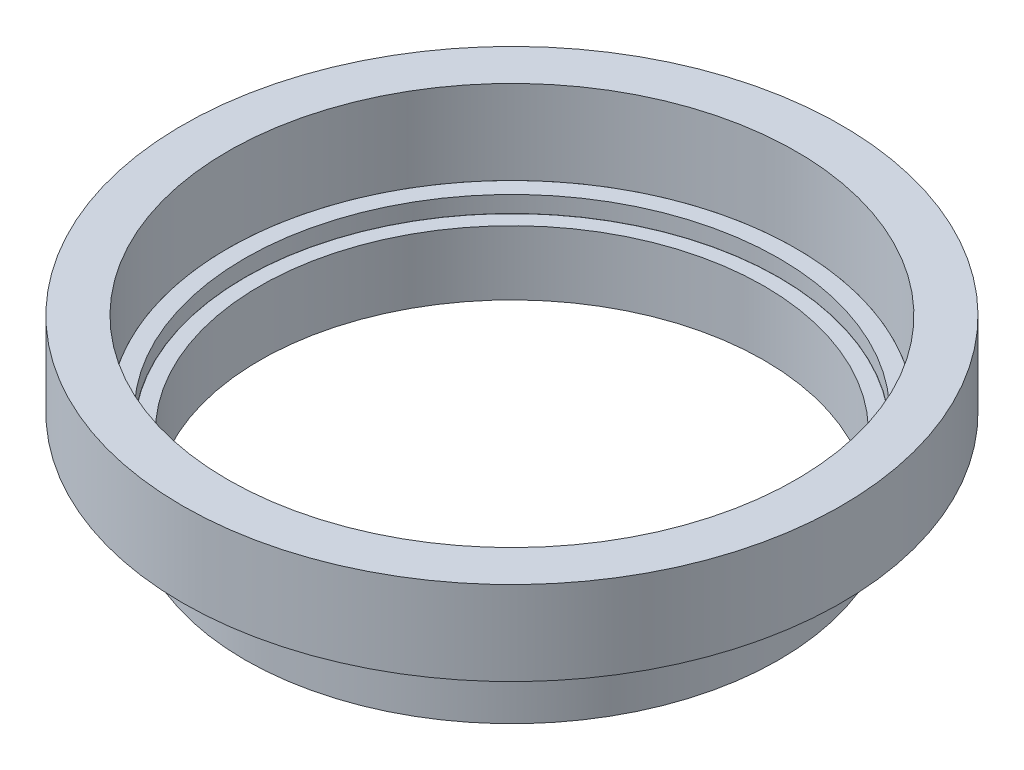
ISO-10303-21;
HEADER;
FILE_DESCRIPTION(('STEP AP214'),'2;1');
FILE_NAME('part.step','',(''),(''),'','','');
FILE_SCHEMA(('AUTOMOTIVE_DESIGN { 1 0 10303 214 1 1 1 1 }'));
ENDSEC;
DATA;
#1=APPLICATION_CONTEXT('core data for automotive mechanical design processes');
#2=APPLICATION_PROTOCOL_DEFINITION('international standard','automotive_design',2000,#1);
#3=PRODUCT_CONTEXT('',#1,'mechanical');
#4=PRODUCT('Part','Part','',(#3));
#5=PRODUCT_RELATED_PRODUCT_CATEGORY('part','',(#4));
#6=PRODUCT_DEFINITION_FORMATION('','',#4);
#7=PRODUCT_DEFINITION_CONTEXT('part definition',#1,'design');
#8=PRODUCT_DEFINITION('design','',#6,#7);
#9=PRODUCT_DEFINITION_SHAPE('','',#8);
#10=(LENGTH_UNIT() NAMED_UNIT(*) SI_UNIT(.MILLI.,.METRE.));
#11=(NAMED_UNIT(*) PLANE_ANGLE_UNIT() SI_UNIT($,.RADIAN.));
#12=(NAMED_UNIT(*) SI_UNIT($,.STERADIAN.) SOLID_ANGLE_UNIT());
#13=UNCERTAINTY_MEASURE_WITH_UNIT(LENGTH_MEASURE(1.E-05),#10,'distance_accuracy_value','');
#14=(GEOMETRIC_REPRESENTATION_CONTEXT(3) GLOBAL_UNCERTAINTY_ASSIGNED_CONTEXT((#13)) GLOBAL_UNIT_ASSIGNED_CONTEXT((#10,
#11,#12)) REPRESENTATION_CONTEXT('',''));
#15=CARTESIAN_POINT('',(0.,0.,0.));
#16=DIRECTION('',(0.,0.,1.));
#17=DIRECTION('',(1.,0.,0.));
#18=AXIS2_PLACEMENT_3D('',#15,#16,#17);
#19=CARTESIAN_POINT('',(0.,-25.4,0.));
#20=DIRECTION('',(0.,-1.,0.));
#21=DIRECTION('',(0.,0.,-1.));
#22=AXIS2_PLACEMENT_3D('',#19,#20,#21);
#23=PLANE('',#22);
#24=CARTESIAN_POINT('',(0.,-25.4,0.));
#25=DIRECTION('',(0.,-1.,0.));
#26=DIRECTION('',(0.,0.,-1.));
#27=AXIS2_PLACEMENT_3D('',#24,#25,#26);
#28=CIRCLE('',#27,41.148);
#29=CARTESIAN_POINT('',(0.,-25.4,-41.148));
#30=VERTEX_POINT('',#29);
#31=EDGE_CURVE('E11',#30,#30,#28,.T.);
#32=ORIENTED_EDGE('',*,*,#31,.T.);
#33=EDGE_LOOP('',(#32));
#34=FACE_BOUND('',#33,.T.);
#35=CARTESIAN_POINT('',(0.,-25.4,0.));
#36=DIRECTION('',(0.,-1.,0.));
#37=DIRECTION('',(0.,0.,-1.));
#38=AXIS2_PLACEMENT_3D('',#35,#36,#37);
#39=CIRCLE('',#38,38.862);
#40=CARTESIAN_POINT('',(0.,-25.4,-38.862));
#41=VERTEX_POINT('',#40);
#42=EDGE_CURVE('E50',#41,#41,#39,.T.);
#43=ORIENTED_EDGE('',*,*,#42,.F.);
#44=EDGE_LOOP('',(#43));
#45=FACE_BOUND('',#44,.T.);
#46=ADVANCED_FACE('F43',(#34,#45),#23,.T.);
#47=CARTESIAN_POINT('',(0.,-25.4,0.));
#48=DIRECTION('',(0.,1.,0.));
#49=DIRECTION('',(0.,0.,1.));
#50=AXIS2_PLACEMENT_3D('',#47,#48,#49);
#51=CYLINDRICAL_SURFACE('',#50,41.148);
#52=ORIENTED_EDGE('',*,*,#31,.F.);
#53=EDGE_LOOP('',(#52));
#54=FACE_BOUND('',#53,.T.);
#55=CARTESIAN_POINT('',(0.,-15.494,0.));
#56=DIRECTION('',(0.,-1.,0.));
#57=DIRECTION('',(0.,0.,-1.));
#58=AXIS2_PLACEMENT_3D('',#55,#56,#57);
#59=CIRCLE('',#58,41.148);
#60=CARTESIAN_POINT('',(0.,-15.494,-41.148));
#61=VERTEX_POINT('',#60);
#62=EDGE_CURVE('E54',#61,#61,#59,.F.);
#63=ORIENTED_EDGE('',*,*,#62,.F.);
#64=EDGE_LOOP('',(#63));
#65=FACE_BOUND('',#64,.T.);
#66=ADVANCED_FACE('F45',(#54,#65),#51,.T.);
#67=CARTESIAN_POINT('',(0.,-25.4,0.));
#68=DIRECTION('',(0.,1.,0.));
#69=DIRECTION('',(0.,0.,1.));
#70=AXIS2_PLACEMENT_3D('',#67,#68,#69);
#71=CYLINDRICAL_SURFACE('',#70,38.862);
#72=ORIENTED_EDGE('',*,*,#42,.T.);
#73=EDGE_LOOP('',(#72));
#74=FACE_BOUND('',#73,.T.);
#75=CARTESIAN_POINT('',(0.,-15.494,0.));
#76=DIRECTION('',(0.,-1.,0.));
#77=DIRECTION('',(0.,0.,-1.));
#78=AXIS2_PLACEMENT_3D('',#75,#76,#77);
#79=CIRCLE('',#78,38.862);
#80=CARTESIAN_POINT('',(0.,-15.494,-38.862));
#81=VERTEX_POINT('',#80);
#82=EDGE_CURVE('E58',#81,#81,#79,.F.);
#83=ORIENTED_EDGE('',*,*,#82,.T.);
#84=EDGE_LOOP('',(#83));
#85=FACE_BOUND('',#84,.T.);
#86=ADVANCED_FACE('F64',(#74,#85),#71,.F.);
#87=CARTESIAN_POINT('',(0.,-15.494,0.));
#88=DIRECTION('',(0.,-1.,0.));
#89=DIRECTION('',(0.,0.,-1.));
#90=AXIS2_PLACEMENT_3D('',#87,#88,#89);
#91=PLANE('',#90);
#92=ORIENTED_EDGE('',*,*,#62,.T.);
#93=EDGE_LOOP('',(#92));
#94=FACE_BOUND('',#93,.T.);
#95=ORIENTED_EDGE('',*,*,#82,.F.);
#96=EDGE_LOOP('',(#95));
#97=FACE_BOUND('',#96,.T.);
#98=ADVANCED_FACE('F66',(#94,#97),#91,.F.);
#99=CLOSED_SHELL('',(#46,#66,#86,#98));
#100=MANIFOLD_SOLID_BREP('B2',#99);
#101=CARTESIAN_POINT('',(0.,-12.954,0.));
#102=DIRECTION('',(0.,-1.,0.));
#103=DIRECTION('',(0.,0.,-1.));
#104=AXIS2_PLACEMENT_3D('',#101,#102,#103);
#105=CYLINDRICAL_SURFACE('',#104,43.815);
#106=CARTESIAN_POINT('',(0.,-12.954,0.));
#107=DIRECTION('',(0.,-1.,0.));
#108=DIRECTION('',(0.,0.,-1.));
#109=AXIS2_PLACEMENT_3D('',#106,#107,#108);
#110=CIRCLE('',#109,43.815);
#111=CARTESIAN_POINT('',(0.,-12.954,-43.815));
#112=VERTEX_POINT('',#111);
#113=EDGE_CURVE('E42',#112,#112,#110,.T.);
#114=ORIENTED_EDGE('',*,*,#113,.T.);
#115=EDGE_LOOP('',(#114));
#116=FACE_BOUND('',#115,.T.);
#117=CARTESIAN_POINT('',(0.,-15.494,0.));
#118=DIRECTION('',(0.,-1.,0.));
#119=DIRECTION('',(0.,0.,-1.));
#120=AXIS2_PLACEMENT_3D('',#117,#118,#119);
#121=CIRCLE('',#120,43.815);
#122=CARTESIAN_POINT('',(0.,-15.494,-43.815));
#123=VERTEX_POINT('',#122);
#124=EDGE_CURVE('E114',#123,#123,#121,.T.);
#125=ORIENTED_EDGE('',*,*,#124,.F.);
#126=EDGE_LOOP('',(#125));
#127=FACE_BOUND('',#126,.T.);
#128=ADVANCED_FACE('F111',(#116,#127),#105,.T.);
#129=CARTESIAN_POINT('',(0.,-12.954,0.));
#130=DIRECTION('',(0.,-1.,0.));
#131=DIRECTION('',(0.,0.,-1.));
#132=AXIS2_PLACEMENT_3D('',#129,#130,#131);
#133=PLANE('',#132);
#134=CARTESIAN_POINT('',(0.,-12.954,0.));
#135=DIRECTION('',(0.,-1.,0.));
#136=DIRECTION('',(0.,0.,-1.));
#137=AXIS2_PLACEMENT_3D('',#134,#135,#136);
#138=CIRCLE('',#137,41.1734);
#139=CARTESIAN_POINT('',(0.,-12.954,-41.1734));
#140=VERTEX_POINT('',#139);
#141=EDGE_CURVE('E121',#140,#140,#138,.T.);
#142=ORIENTED_EDGE('',*,*,#141,.T.);
#143=EDGE_LOOP('',(#142));
#144=FACE_BOUND('',#143,.T.);
#145=ORIENTED_EDGE('',*,*,#113,.F.);
#146=EDGE_LOOP('',(#145));
#147=FACE_BOUND('',#146,.T.);
#148=ADVANCED_FACE('F129',(#144,#147),#133,.F.);
#149=CARTESIAN_POINT('',(0.,-15.494,0.));
#150=DIRECTION('',(0.,-1.,0.));
#151=DIRECTION('',(0.,0.,-1.));
#152=AXIS2_PLACEMENT_3D('',#149,#150,#151);
#153=PLANE('',#152);
#154=CARTESIAN_POINT('',(0.,-15.494,0.));
#155=DIRECTION('',(0.,-1.,0.));
#156=DIRECTION('',(0.,0.,-1.));
#157=AXIS2_PLACEMENT_3D('',#154,#155,#156);
#158=CIRCLE('',#157,41.1734);
#159=CARTESIAN_POINT('',(0.,-15.494,-41.1734));
#160=VERTEX_POINT('',#159);
#161=EDGE_CURVE('E123',#160,#160,#158,.T.);
#162=ORIENTED_EDGE('',*,*,#161,.F.);
#163=EDGE_LOOP('',(#162));
#164=FACE_BOUND('',#163,.T.);
#165=ORIENTED_EDGE('',*,*,#124,.T.);
#166=EDGE_LOOP('',(#165));
#167=FACE_BOUND('',#166,.T.);
#168=ADVANCED_FACE('F135',(#164,#167),#153,.T.);
#169=CARTESIAN_POINT('',(0.,-12.954,0.));
#170=DIRECTION('',(0.,-1.,0.));
#171=DIRECTION('',(0.,0.,-1.));
#172=AXIS2_PLACEMENT_3D('',#169,#170,#171);
#173=CYLINDRICAL_SURFACE('',#172,41.1734);
#174=ORIENTED_EDGE('',*,*,#141,.F.);
#175=EDGE_LOOP('',(#174));
#176=FACE_BOUND('',#175,.T.);
#177=ORIENTED_EDGE('',*,*,#161,.T.);
#178=EDGE_LOOP('',(#177));
#179=FACE_BOUND('',#178,.T.);
#180=ADVANCED_FACE('F132',(#176,#179),#173,.F.);
#181=CLOSED_SHELL('',(#128,#148,#168,#180));
#182=MANIFOLD_SOLID_BREP('B6',#181);
#183=CARTESIAN_POINT('',(0.,-12.954,0.));
#184=DIRECTION('',(0.,1.,0.));
#185=DIRECTION('',(0.,0.,1.));
#186=AXIS2_PLACEMENT_3D('',#183,#184,#185);
#187=CYLINDRICAL_SURFACE('',#186,50.8);
#188=CARTESIAN_POINT('',(0.,-12.954,0.));
#189=DIRECTION('',(0.,1.,0.));
#190=DIRECTION('',(0.,0.,1.));
#191=AXIS2_PLACEMENT_3D('',#188,#189,#190);
#192=CIRCLE('',#191,50.8);
#193=CARTESIAN_POINT('',(0.,-12.954,50.8));
#194=VERTEX_POINT('',#193);
#195=EDGE_CURVE('E110',#194,#194,#192,.T.);
#196=ORIENTED_EDGE('',*,*,#195,.T.);
#197=EDGE_LOOP('',(#196));
#198=FACE_BOUND('',#197,.T.);
#199=CARTESIAN_POINT('',(0.,0.,0.));
#200=DIRECTION('',(0.,1.,0.));
#201=DIRECTION('',(0.,0.,1.));
#202=AXIS2_PLACEMENT_3D('',#199,#200,#201);
#203=CIRCLE('',#202,50.8);
#204=CARTESIAN_POINT('',(0.,0.,50.8));
#205=VERTEX_POINT('',#204);
#206=EDGE_CURVE('E175',#205,#205,#203,.T.);
#207=ORIENTED_EDGE('',*,*,#206,.F.);
#208=EDGE_LOOP('',(#207));
#209=FACE_BOUND('',#208,.T.);
#210=ADVANCED_FACE('F172',(#198,#209),#187,.T.);
#211=CARTESIAN_POINT('',(0.,-12.954,0.));
#212=DIRECTION('',(0.,1.,0.));
#213=DIRECTION('',(0.,0.,1.));
#214=AXIS2_PLACEMENT_3D('',#211,#212,#213);
#215=PLANE('',#214);
#216=CARTESIAN_POINT('',(0.,-12.954,0.));
#217=DIRECTION('',(0.,1.,0.));
#218=DIRECTION('',(0.,0.,1.));
#219=AXIS2_PLACEMENT_3D('',#216,#217,#218);
#220=CIRCLE('',#219,43.815);
#221=CARTESIAN_POINT('',(0.,-12.954,43.815));
#222=VERTEX_POINT('',#221);
#223=EDGE_CURVE('E182',#222,#222,#220,.T.);
#224=ORIENTED_EDGE('',*,*,#223,.T.);
#225=EDGE_LOOP('',(#224));
#226=FACE_BOUND('',#225,.T.);
#227=ORIENTED_EDGE('',*,*,#195,.F.);
#228=EDGE_LOOP('',(#227));
#229=FACE_BOUND('',#228,.T.);
#230=ADVANCED_FACE('F190',(#226,#229),#215,.F.);
#231=CARTESIAN_POINT('',(0.,0.,0.));
#232=DIRECTION('',(0.,1.,0.));
#233=DIRECTION('',(0.,0.,1.));
#234=AXIS2_PLACEMENT_3D('',#231,#232,#233);
#235=PLANE('',#234);
#236=CARTESIAN_POINT('',(0.,0.,0.));
#237=DIRECTION('',(0.,1.,0.));
#238=DIRECTION('',(0.,0.,1.));
#239=AXIS2_PLACEMENT_3D('',#236,#237,#238);
#240=CIRCLE('',#239,43.815);
#241=CARTESIAN_POINT('',(0.,0.,43.815));
#242=VERTEX_POINT('',#241);
#243=EDGE_CURVE('E184',#242,#242,#240,.T.);
#244=ORIENTED_EDGE('',*,*,#243,.F.);
#245=EDGE_LOOP('',(#244));
#246=FACE_BOUND('',#245,.T.);
#247=ORIENTED_EDGE('',*,*,#206,.T.);
#248=EDGE_LOOP('',(#247));
#249=FACE_BOUND('',#248,.T.);
#250=ADVANCED_FACE('F196',(#246,#249),#235,.T.);
#251=CARTESIAN_POINT('',(0.,-12.954,0.));
#252=DIRECTION('',(0.,1.,0.));
#253=DIRECTION('',(0.,0.,1.));
#254=AXIS2_PLACEMENT_3D('',#251,#252,#253);
#255=CYLINDRICAL_SURFACE('',#254,43.815);
#256=ORIENTED_EDGE('',*,*,#223,.F.);
#257=EDGE_LOOP('',(#256));
#258=FACE_BOUND('',#257,.T.);
#259=ORIENTED_EDGE('',*,*,#243,.T.);
#260=EDGE_LOOP('',(#259));
#261=FACE_BOUND('',#260,.T.);
#262=ADVANCED_FACE('F193',(#258,#261),#255,.F.);
#263=CLOSED_SHELL('',(#210,#230,#250,#262));
#264=MANIFOLD_SOLID_BREP('B37',#263);
#265=ADVANCED_BREP_SHAPE_REPRESENTATION('',(#18,#100,#182,#264),#14);
#266=SHAPE_DEFINITION_REPRESENTATION(#9,#265);
ENDSEC;
END-ISO-10303-21;
